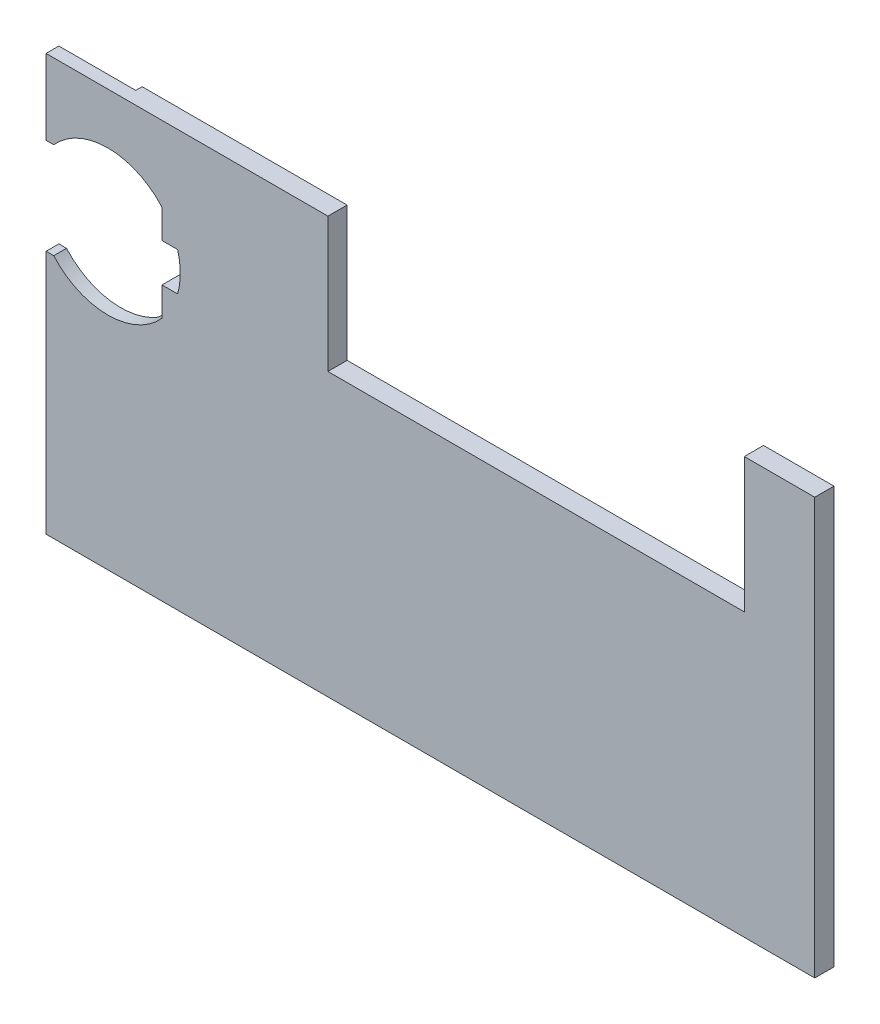
ISO-10303-21;
HEADER;
FILE_DESCRIPTION(('STEP AP214'),'2;1');
FILE_NAME('part.step','',(''),(''),'','','');
FILE_SCHEMA(('AUTOMOTIVE_DESIGN { 1 0 10303 214 1 1 1 1 }'));
ENDSEC;
DATA;
#1=APPLICATION_CONTEXT('core data for automotive mechanical design processes');
#2=APPLICATION_PROTOCOL_DEFINITION('international standard','automotive_design',2000,#1);
#3=PRODUCT_CONTEXT('',#1,'mechanical');
#4=PRODUCT('Part','Part','',(#3));
#5=PRODUCT_RELATED_PRODUCT_CATEGORY('part','',(#4));
#6=PRODUCT_DEFINITION_FORMATION('','',#4);
#7=PRODUCT_DEFINITION_CONTEXT('part definition',#1,'design');
#8=PRODUCT_DEFINITION('design','',#6,#7);
#9=PRODUCT_DEFINITION_SHAPE('','',#8);
#10=(LENGTH_UNIT() NAMED_UNIT(*) SI_UNIT(.MILLI.,.METRE.));
#11=(NAMED_UNIT(*) PLANE_ANGLE_UNIT() SI_UNIT($,.RADIAN.));
#12=(NAMED_UNIT(*) SI_UNIT($,.STERADIAN.) SOLID_ANGLE_UNIT());
#13=UNCERTAINTY_MEASURE_WITH_UNIT(LENGTH_MEASURE(1.E-05),#10,'distance_accuracy_value','');
#14=(GEOMETRIC_REPRESENTATION_CONTEXT(3) GLOBAL_UNCERTAINTY_ASSIGNED_CONTEXT((#13)) GLOBAL_UNIT_ASSIGNED_CONTEXT((#10,
#11,#12)) REPRESENTATION_CONTEXT('',''));
#15=CARTESIAN_POINT('',(0.,0.,0.));
#16=DIRECTION('',(0.,0.,1.));
#17=DIRECTION('',(1.,0.,0.));
#18=AXIS2_PLACEMENT_3D('',#15,#16,#17);
#19=CARTESIAN_POINT('',(-60.,32.5,3.));
#20=DIRECTION('',(0.,1.,0.));
#21=DIRECTION('',(0.,0.,1.));
#22=AXIS2_PLACEMENT_3D('',#19,#20,#21);
#23=PLANE('',#22);
#24=DIRECTION('',(0.,0.,-1.));
#25=VECTOR('',#24,1.);
#26=CARTESIAN_POINT('',(49.,32.5,3.));
#27=LINE('',#26,#25);
#28=CARTESIAN_POINT('',(49.,32.5,3.));
#29=VERTEX_POINT('',#28);
#30=CARTESIAN_POINT('',(49.,32.5,0.));
#31=VERTEX_POINT('',#30);
#32=EDGE_CURVE('E294',#29,#31,#27,.T.);
#33=ORIENTED_EDGE('',*,*,#32,.F.);
#34=DIRECTION('',(1.,0.,0.));
#35=VECTOR('',#34,1.);
#36=CARTESIAN_POINT('',(-60.,32.5,3.));
#37=LINE('',#36,#35);
#38=CARTESIAN_POINT('',(60.,32.5,3.));
#39=VERTEX_POINT('',#38);
#40=EDGE_CURVE('E285',#29,#39,#37,.T.);
#41=ORIENTED_EDGE('',*,*,#40,.T.);
#42=DIRECTION('',(0.,0.,-1.));
#43=VECTOR('',#42,1.);
#44=CARTESIAN_POINT('',(60.,32.5,3.));
#45=LINE('',#44,#43);
#46=CARTESIAN_POINT('',(60.,32.5,0.));
#47=VERTEX_POINT('',#46);
#48=EDGE_CURVE('E538',#39,#47,#45,.T.);
#49=ORIENTED_EDGE('',*,*,#48,.T.);
#50=DIRECTION('',(1.,0.,0.));
#51=VECTOR('',#50,1.);
#52=CARTESIAN_POINT('',(-60.,32.5,0.));
#53=LINE('',#52,#51);
#54=EDGE_CURVE('E438',#31,#47,#53,.T.);
#55=ORIENTED_EDGE('',*,*,#54,.F.);
#56=EDGE_LOOP('',(#33,#41,#49,#55));
#57=FACE_BOUND('',#56,.T.);
#58=ADVANCED_FACE('F33',(#57),#23,.T.);
#59=CARTESIAN_POINT('',(-60.,20.75,3.));
#60=DIRECTION('',(-1.,0.,0.));
#61=DIRECTION('',(0.,-1.,0.));
#62=AXIS2_PLACEMENT_3D('',#59,#60,#61);
#63=PLANE('',#62);
#64=DIRECTION('',(0.,1.,0.));
#65=VECTOR('',#64,1.);
#66=CARTESIAN_POINT('',(-60.,32.5,1.));
#67=LINE('',#66,#65);
#68=CARTESIAN_POINT('',(-60.,20.75,1.));
#69=VERTEX_POINT('',#68);
#70=CARTESIAN_POINT('',(-60.,32.5,1.));
#71=VERTEX_POINT('',#70);
#72=EDGE_CURVE('E304',#69,#71,#67,.T.);
#73=ORIENTED_EDGE('',*,*,#72,.F.);
#74=DIRECTION('',(0.,0.,-1.));
#75=VECTOR('',#74,1.);
#76=CARTESIAN_POINT('',(-60.,20.75,3.));
#77=LINE('',#76,#75);
#78=CARTESIAN_POINT('',(-60.,20.75,3.));
#79=VERTEX_POINT('',#78);
#80=EDGE_CURVE('E41',#79,#69,#77,.T.);
#81=ORIENTED_EDGE('',*,*,#80,.F.);
#82=DIRECTION('',(0.,1.,0.));
#83=VECTOR('',#82,1.);
#84=CARTESIAN_POINT('',(-60.,20.75,3.));
#85=LINE('',#84,#83);
#86=CARTESIAN_POINT('',(-60.,32.5,3.));
#87=VERTEX_POINT('',#86);
#88=EDGE_CURVE('E445',#79,#87,#85,.T.);
#89=ORIENTED_EDGE('',*,*,#88,.T.);
#90=DIRECTION('',(0.,0.,-1.));
#91=VECTOR('',#90,1.);
#92=CARTESIAN_POINT('',(-60.,32.5,3.));
#93=LINE('',#92,#91);
#94=EDGE_CURVE('E480',#87,#71,#93,.T.);
#95=ORIENTED_EDGE('',*,*,#94,.T.);
#96=EDGE_LOOP('',(#73,#81,#89,#95));
#97=FACE_BOUND('',#96,.T.);
#98=ADVANCED_FACE('F35',(#97),#63,.T.);
#99=CARTESIAN_POINT('',(-60.,20.75,3.));
#100=DIRECTION('',(0.,1.,0.));
#101=DIRECTION('',(0.,0.,1.));
#102=AXIS2_PLACEMENT_3D('',#99,#100,#101);
#103=PLANE('',#102);
#104=ORIENTED_EDGE('',*,*,#80,.T.);
#105=DIRECTION('',(1.,0.,0.));
#106=VECTOR('',#105,1.);
#107=CARTESIAN_POINT('',(-60.,20.75,1.));
#108=LINE('',#107,#106);
#109=CARTESIAN_POINT('',(-58.8,20.75,1.));
#110=VERTEX_POINT('',#109);
#111=EDGE_CURVE('E361',#69,#110,#108,.T.);
#112=ORIENTED_EDGE('',*,*,#111,.T.);
#113=DIRECTION('',(0.,0.,-1.));
#114=VECTOR('',#113,1.);
#115=CARTESIAN_POINT('',(-58.8,20.75,3.));
#116=LINE('',#115,#114);
#117=CARTESIAN_POINT('',(-58.8,20.75,3.));
#118=VERTEX_POINT('',#117);
#119=EDGE_CURVE('E508',#118,#110,#116,.T.);
#120=ORIENTED_EDGE('',*,*,#119,.F.);
#121=DIRECTION('',(1.,0.,0.));
#122=VECTOR('',#121,1.);
#123=CARTESIAN_POINT('',(-60.,20.75,3.));
#124=LINE('',#123,#122);
#125=EDGE_CURVE('E478',#79,#118,#124,.T.);
#126=ORIENTED_EDGE('',*,*,#125,.F.);
#127=EDGE_LOOP('',(#104,#112,#120,#126));
#128=FACE_BOUND('',#127,.T.);
#129=ADVANCED_FACE('F566',(#128),#103,.F.);
#130=CARTESIAN_POINT('',(-50.3477813563538,13.25,3.));
#131=DIRECTION('',(0.,0.,-1.));
#132=DIRECTION('',(-1.,0.,0.));
#133=AXIS2_PLACEMENT_3D('',#130,#131,#132);
#134=CYLINDRICAL_SURFACE('',#133,11.3);
#135=DIRECTION('',(0.,0.,-1.));
#136=VECTOR('',#135,1.);
#137=CARTESIAN_POINT('',(-44.45,22.8887849375658,3.));
#138=LINE('',#137,#136);
#139=CARTESIAN_POINT('',(-44.45,22.8887849375658,0.));
#140=VERTEX_POINT('',#139);
#141=CARTESIAN_POINT('',(-44.45,22.8887849375658,1.));
#142=VERTEX_POINT('',#141);
#143=EDGE_CURVE('E352',#140,#142,#138,.F.);
#144=ORIENTED_EDGE('',*,*,#143,.F.);
#145=CARTESIAN_POINT('',(-50.3477813563538,13.25,0.));
#146=DIRECTION('',(0.,0.,1.));
#147=DIRECTION('',(1.,0.,0.));
#148=AXIS2_PLACEMENT_3D('',#145,#146,#147);
#149=CIRCLE('',#148,11.3);
#150=CARTESIAN_POINT('',(-41.8955627127076,20.75,0.));
#151=VERTEX_POINT('',#150);
#152=EDGE_CURVE('E448',#151,#140,#149,.T.);
#153=ORIENTED_EDGE('',*,*,#152,.F.);
#154=DIRECTION('',(0.,0.,-1.));
#155=VECTOR('',#154,1.);
#156=CARTESIAN_POINT('',(-41.8955627127076,20.75,3.));
#157=LINE('',#156,#155);
#158=CARTESIAN_POINT('',(-41.8955627127076,20.75,3.));
#159=VERTEX_POINT('',#158);
#160=EDGE_CURVE('E511',#159,#151,#157,.T.);
#161=ORIENTED_EDGE('',*,*,#160,.F.);
#162=CARTESIAN_POINT('',(-50.3477813563538,13.25,3.));
#163=DIRECTION('',(0.,0.,1.));
#164=DIRECTION('',(1.,0.,0.));
#165=AXIS2_PLACEMENT_3D('',#162,#163,#164);
#166=CIRCLE('',#165,11.3);
#167=EDGE_CURVE('E475',#159,#118,#166,.T.);
#168=ORIENTED_EDGE('',*,*,#167,.T.);
#169=ORIENTED_EDGE('',*,*,#119,.T.);
#170=CARTESIAN_POINT('',(-50.3477813563538,13.25,1.));
#171=DIRECTION('',(0.,0.,1.));
#172=DIRECTION('',(1.,0.,0.));
#173=AXIS2_PLACEMENT_3D('',#170,#171,#172);
#174=CIRCLE('',#173,11.3);
#175=EDGE_CURVE('E359',#142,#110,#174,.T.);
#176=ORIENTED_EDGE('',*,*,#175,.F.);
#177=EDGE_LOOP('',(#144,#153,#161,#168,#169,#176));
#178=FACE_BOUND('',#177,.T.);
#179=ADVANCED_FACE('F570',(#178),#134,.F.);
#180=CARTESIAN_POINT('',(-41.8955627127076,20.75,3.));
#181=DIRECTION('',(1.,0.,0.));
#182=DIRECTION('',(0.,0.,-1.));
#183=AXIS2_PLACEMENT_3D('',#180,#181,#182);
#184=PLANE('',#183);
#185=DIRECTION('',(0.,-1.,0.));
#186=VECTOR('',#185,1.);
#187=CARTESIAN_POINT('',(-41.8955627127076,20.75,0.));
#188=LINE('',#187,#186);
#189=CARTESIAN_POINT('',(-41.8955627127076,16.25,0.));
#190=VERTEX_POINT('',#189);
#191=EDGE_CURVE('E502',#151,#190,#188,.T.);
#192=ORIENTED_EDGE('',*,*,#191,.T.);
#193=DIRECTION('',(0.,0.,-1.));
#194=VECTOR('',#193,1.);
#195=CARTESIAN_POINT('',(-41.8955627127076,16.25,3.));
#196=LINE('',#195,#194);
#197=CARTESIAN_POINT('',(-41.8955627127076,16.25,3.));
#198=VERTEX_POINT('',#197);
#199=EDGE_CURVE('E513',#198,#190,#196,.T.);
#200=ORIENTED_EDGE('',*,*,#199,.F.);
#201=DIRECTION('',(0.,-1.,0.));
#202=VECTOR('',#201,1.);
#203=CARTESIAN_POINT('',(-41.8955627127076,20.75,3.));
#204=LINE('',#203,#202);
#205=EDGE_CURVE('E473',#159,#198,#204,.T.);
#206=ORIENTED_EDGE('',*,*,#205,.F.);
#207=ORIENTED_EDGE('',*,*,#160,.T.);
#208=EDGE_LOOP('',(#192,#200,#206,#207));
#209=FACE_BOUND('',#208,.T.);
#210=ADVANCED_FACE('F578',(#209),#184,.F.);
#211=CARTESIAN_POINT('',(-41.8955627127076,16.25,3.));
#212=DIRECTION('',(0.,1.,0.));
#213=DIRECTION('',(0.,0.,1.));
#214=AXIS2_PLACEMENT_3D('',#211,#212,#213);
#215=PLANE('',#214);
#216=DIRECTION('',(1.,0.,0.));
#217=VECTOR('',#216,1.);
#218=CARTESIAN_POINT('',(-41.8955627127076,16.25,0.));
#219=LINE('',#218,#217);
#220=CARTESIAN_POINT('',(-39.4532873341424,16.25,0.));
#221=VERTEX_POINT('',#220);
#222=EDGE_CURVE('E500',#190,#221,#219,.T.);
#223=ORIENTED_EDGE('',*,*,#222,.T.);
#224=DIRECTION('',(0.,0.,-1.));
#225=VECTOR('',#224,1.);
#226=CARTESIAN_POINT('',(-39.4532873341424,16.25,3.));
#227=LINE('',#226,#225);
#228=CARTESIAN_POINT('',(-39.4532873341424,16.25,3.));
#229=VERTEX_POINT('',#228);
#230=EDGE_CURVE('E516',#229,#221,#227,.T.);
#231=ORIENTED_EDGE('',*,*,#230,.F.);
#232=DIRECTION('',(1.,0.,0.));
#233=VECTOR('',#232,1.);
#234=CARTESIAN_POINT('',(-41.8955627127076,16.25,3.));
#235=LINE('',#234,#233);
#236=EDGE_CURVE('E471',#198,#229,#235,.T.);
#237=ORIENTED_EDGE('',*,*,#236,.F.);
#238=ORIENTED_EDGE('',*,*,#199,.T.);
#239=EDGE_LOOP('',(#223,#231,#237,#238));
#240=FACE_BOUND('',#239,.T.);
#241=ADVANCED_FACE('F582',(#240),#215,.F.);
#242=CARTESIAN_POINT('',(-50.3477813563538,13.25,3.));
#243=DIRECTION('',(0.,0.,-1.));
#244=DIRECTION('',(-1.,0.,0.));
#245=AXIS2_PLACEMENT_3D('',#242,#243,#244);
#246=CYLINDRICAL_SURFACE('',#245,11.3);
#247=CARTESIAN_POINT('',(-50.3477813563538,13.25,0.));
#248=DIRECTION('',(0.,0.,-1.));
#249=DIRECTION('',(-1.,0.,0.));
#250=AXIS2_PLACEMENT_3D('',#247,#248,#249);
#251=CIRCLE('',#250,11.3);
#252=CARTESIAN_POINT('',(-39.4532873341424,10.25,0.));
#253=VERTEX_POINT('',#252);
#254=EDGE_CURVE('E497',#221,#253,#251,.T.);
#255=ORIENTED_EDGE('',*,*,#254,.T.);
#256=DIRECTION('',(0.,0.,-1.));
#257=VECTOR('',#256,1.);
#258=CARTESIAN_POINT('',(-39.4532873341424,10.25,3.));
#259=LINE('',#258,#257);
#260=CARTESIAN_POINT('',(-39.4532873341424,10.25,3.));
#261=VERTEX_POINT('',#260);
#262=EDGE_CURVE('E519',#261,#253,#259,.T.);
#263=ORIENTED_EDGE('',*,*,#262,.F.);
#264=CARTESIAN_POINT('',(-50.3477813563538,13.25,3.));
#265=DIRECTION('',(0.,0.,-1.));
#266=DIRECTION('',(-1.,0.,0.));
#267=AXIS2_PLACEMENT_3D('',#264,#265,#266);
#268=CIRCLE('',#267,11.3);
#269=EDGE_CURVE('E469',#229,#261,#268,.T.);
#270=ORIENTED_EDGE('',*,*,#269,.F.);
#271=ORIENTED_EDGE('',*,*,#230,.T.);
#272=EDGE_LOOP('',(#255,#263,#270,#271));
#273=FACE_BOUND('',#272,.T.);
#274=ADVANCED_FACE('F587',(#273),#246,.F.);
#275=CARTESIAN_POINT('',(-41.8955627127076,10.25,3.));
#276=DIRECTION('',(0.,1.,0.));
#277=DIRECTION('',(0.,0.,1.));
#278=AXIS2_PLACEMENT_3D('',#275,#276,#277);
#279=PLANE('',#278);
#280=DIRECTION('',(1.,0.,0.));
#281=VECTOR('',#280,1.);
#282=CARTESIAN_POINT('',(-41.8955627127076,10.25,0.));
#283=LINE('',#282,#281);
#284=CARTESIAN_POINT('',(-41.8955627127076,10.25,0.));
#285=VERTEX_POINT('',#284);
#286=EDGE_CURVE('E494',#285,#253,#283,.T.);
#287=ORIENTED_EDGE('',*,*,#286,.F.);
#288=DIRECTION('',(0.,0.,-1.));
#289=VECTOR('',#288,1.);
#290=CARTESIAN_POINT('',(-41.8955627127076,10.25,3.));
#291=LINE('',#290,#289);
#292=CARTESIAN_POINT('',(-41.8955627127076,10.25,3.));
#293=VERTEX_POINT('',#292);
#294=EDGE_CURVE('E521',#293,#285,#291,.T.);
#295=ORIENTED_EDGE('',*,*,#294,.F.);
#296=DIRECTION('',(1.,0.,0.));
#297=VECTOR('',#296,1.);
#298=CARTESIAN_POINT('',(-41.8955627127076,10.25,3.));
#299=LINE('',#298,#297);
#300=EDGE_CURVE('E466',#293,#261,#299,.T.);
#301=ORIENTED_EDGE('',*,*,#300,.T.);
#302=ORIENTED_EDGE('',*,*,#262,.T.);
#303=EDGE_LOOP('',(#287,#295,#301,#302));
#304=FACE_BOUND('',#303,.T.);
#305=ADVANCED_FACE('F594',(#304),#279,.T.);
#306=CARTESIAN_POINT('',(-41.8955627127076,10.25,3.));
#307=DIRECTION('',(1.,0.,0.));
#308=DIRECTION('',(0.,0.,-1.));
#309=AXIS2_PLACEMENT_3D('',#306,#307,#308);
#310=PLANE('',#309);
#311=DIRECTION('',(0.,-1.,0.));
#312=VECTOR('',#311,1.);
#313=CARTESIAN_POINT('',(-41.8955627127076,10.25,0.));
#314=LINE('',#313,#312);
#315=CARTESIAN_POINT('',(-41.8955627127076,5.75,0.));
#316=VERTEX_POINT('',#315);
#317=EDGE_CURVE('E491',#285,#316,#314,.T.);
#318=ORIENTED_EDGE('',*,*,#317,.T.);
#319=DIRECTION('',(0.,0.,-1.));
#320=VECTOR('',#319,1.);
#321=CARTESIAN_POINT('',(-41.8955627127076,5.75,3.));
#322=LINE('',#321,#320);
#323=CARTESIAN_POINT('',(-41.8955627127076,5.75,3.));
#324=VERTEX_POINT('',#323);
#325=EDGE_CURVE('E523',#324,#316,#322,.T.);
#326=ORIENTED_EDGE('',*,*,#325,.F.);
#327=DIRECTION('',(0.,-1.,0.));
#328=VECTOR('',#327,1.);
#329=CARTESIAN_POINT('',(-41.8955627127076,10.25,3.));
#330=LINE('',#329,#328);
#331=EDGE_CURVE('E464',#293,#324,#330,.T.);
#332=ORIENTED_EDGE('',*,*,#331,.F.);
#333=ORIENTED_EDGE('',*,*,#294,.T.);
#334=EDGE_LOOP('',(#318,#326,#332,#333));
#335=FACE_BOUND('',#334,.T.);
#336=ADVANCED_FACE('F597',(#335),#310,.F.);
#337=CARTESIAN_POINT('',(-50.3477813563538,13.25,3.));
#338=DIRECTION('',(0.,0.,-1.));
#339=DIRECTION('',(-1.,0.,0.));
#340=AXIS2_PLACEMENT_3D('',#337,#338,#339);
#341=CYLINDRICAL_SURFACE('',#340,11.3);
#342=DIRECTION('',(0.,0.,-1.));
#343=VECTOR('',#342,1.);
#344=CARTESIAN_POINT('',(-44.45,3.6112150624342,3.));
#345=LINE('',#344,#343);
#346=CARTESIAN_POINT('',(-44.45,3.6112150624342,1.));
#347=VERTEX_POINT('',#346);
#348=CARTESIAN_POINT('',(-44.45,3.6112150624342,0.));
#349=VERTEX_POINT('',#348);
#350=EDGE_CURVE('E56',#347,#349,#345,.T.);
#351=ORIENTED_EDGE('',*,*,#350,.F.);
#352=CARTESIAN_POINT('',(-50.3477813563538,13.25,1.));
#353=DIRECTION('',(0.,0.,1.));
#354=DIRECTION('',(1.,0.,0.));
#355=AXIS2_PLACEMENT_3D('',#352,#353,#354);
#356=CIRCLE('',#355,11.3);
#357=CARTESIAN_POINT('',(-58.8,5.75000000000001,1.));
#358=VERTEX_POINT('',#357);
#359=EDGE_CURVE('E357',#358,#347,#356,.T.);
#360=ORIENTED_EDGE('',*,*,#359,.F.);
#361=DIRECTION('',(0.,0.,-1.));
#362=VECTOR('',#361,1.);
#363=CARTESIAN_POINT('',(-58.8,5.75000000000001,3.));
#364=LINE('',#363,#362);
#365=CARTESIAN_POINT('',(-58.8,5.75000000000001,3.));
#366=VERTEX_POINT('',#365);
#367=EDGE_CURVE('E526',#366,#358,#364,.T.);
#368=ORIENTED_EDGE('',*,*,#367,.F.);
#369=CARTESIAN_POINT('',(-50.3477813563538,13.25,3.));
#370=DIRECTION('',(0.,0.,1.));
#371=DIRECTION('',(1.,0.,0.));
#372=AXIS2_PLACEMENT_3D('',#369,#370,#371);
#373=CIRCLE('',#372,11.3);
#374=EDGE_CURVE('E461',#366,#324,#373,.T.);
#375=ORIENTED_EDGE('',*,*,#374,.T.);
#376=ORIENTED_EDGE('',*,*,#325,.T.);
#377=CARTESIAN_POINT('',(-50.3477813563538,13.25,0.));
#378=DIRECTION('',(0.,0.,1.));
#379=DIRECTION('',(1.,0.,0.));
#380=AXIS2_PLACEMENT_3D('',#377,#378,#379);
#381=CIRCLE('',#380,11.3);
#382=EDGE_CURVE('E489',#349,#316,#381,.T.);
#383=ORIENTED_EDGE('',*,*,#382,.F.);
#384=EDGE_LOOP('',(#351,#360,#368,#375,#376,#383));
#385=FACE_BOUND('',#384,.T.);
#386=ADVANCED_FACE('F600',(#385),#341,.F.);
#387=CARTESIAN_POINT('',(-58.8,5.75000000000001,3.));
#388=DIRECTION('',(0.,-1.,0.));
#389=DIRECTION('',(0.,0.,-1.));
#390=AXIS2_PLACEMENT_3D('',#387,#388,#389);
#391=PLANE('',#390);
#392=ORIENTED_EDGE('',*,*,#367,.T.);
#393=DIRECTION('',(-1.,0.,0.));
#394=VECTOR('',#393,1.);
#395=CARTESIAN_POINT('',(-58.8,5.75000000000001,1.));
#396=LINE('',#395,#394);
#397=CARTESIAN_POINT('',(-60.,5.75000000000001,1.));
#398=VERTEX_POINT('',#397);
#399=EDGE_CURVE('E354',#358,#398,#396,.T.);
#400=ORIENTED_EDGE('',*,*,#399,.T.);
#401=DIRECTION('',(0.,0.,-1.));
#402=VECTOR('',#401,1.);
#403=CARTESIAN_POINT('',(-60.,5.75000000000001,3.));
#404=LINE('',#403,#402);
#405=CARTESIAN_POINT('',(-60.,5.75000000000001,3.));
#406=VERTEX_POINT('',#405);
#407=EDGE_CURVE('E529',#406,#398,#404,.T.);
#408=ORIENTED_EDGE('',*,*,#407,.F.);
#409=DIRECTION('',(-1.,0.,0.));
#410=VECTOR('',#409,1.);
#411=CARTESIAN_POINT('',(-58.8,5.75000000000001,3.));
#412=LINE('',#411,#410);
#413=EDGE_CURVE('E459',#366,#406,#412,.T.);
#414=ORIENTED_EDGE('',*,*,#413,.F.);
#415=EDGE_LOOP('',(#392,#400,#408,#414));
#416=FACE_BOUND('',#415,.T.);
#417=ADVANCED_FACE('F607',(#416),#391,.F.);
#418=CARTESIAN_POINT('',(-60.,5.75000000000001,3.));
#419=DIRECTION('',(1.,0.,0.));
#420=DIRECTION('',(0.,1.,0.));
#421=AXIS2_PLACEMENT_3D('',#418,#419,#420);
#422=PLANE('',#421);
#423=ORIENTED_EDGE('',*,*,#407,.T.);
#424=CARTESIAN_POINT('',(-60.,-32.5,1.));
#425=VERTEX_POINT('',#424);
#426=EDGE_CURVE('E301',#425,#398,#67,.T.);
#427=ORIENTED_EDGE('',*,*,#426,.F.);
#428=DIRECTION('',(0.,0.,-1.));
#429=VECTOR('',#428,1.);
#430=CARTESIAN_POINT('',(-60.,-32.5,3.));
#431=LINE('',#430,#429);
#432=CARTESIAN_POINT('',(-60.,-32.5,3.));
#433=VERTEX_POINT('',#432);
#434=EDGE_CURVE('E532',#433,#425,#431,.T.);
#435=ORIENTED_EDGE('',*,*,#434,.F.);
#436=DIRECTION('',(0.,-1.,0.));
#437=VECTOR('',#436,1.);
#438=CARTESIAN_POINT('',(-60.,5.75000000000001,3.));
#439=LINE('',#438,#437);
#440=EDGE_CURVE('E457',#406,#433,#439,.T.);
#441=ORIENTED_EDGE('',*,*,#440,.F.);
#442=EDGE_LOOP('',(#423,#427,#435,#441));
#443=FACE_BOUND('',#442,.T.);
#444=ADVANCED_FACE('F610',(#443),#422,.F.);
#445=CARTESIAN_POINT('',(-60.,-32.5,3.));
#446=DIRECTION('',(0.,1.,0.));
#447=DIRECTION('',(0.,0.,1.));
#448=AXIS2_PLACEMENT_3D('',#445,#446,#447);
#449=PLANE('',#448);
#450=DIRECTION('',(-1.,0.,0.));
#451=VECTOR('',#450,1.);
#452=CARTESIAN_POINT('',(-60.,-32.5,1.));
#453=LINE('',#452,#451);
#454=CARTESIAN_POINT('',(-48.,-32.5,1.));
#455=VERTEX_POINT('',#454);
#456=EDGE_CURVE('E323',#455,#425,#453,.T.);
#457=ORIENTED_EDGE('',*,*,#456,.F.);
#458=DIRECTION('',(0.,0.,-1.));
#459=VECTOR('',#458,1.);
#460=CARTESIAN_POINT('',(-48.,-32.5,1.));
#461=LINE('',#460,#459);
#462=CARTESIAN_POINT('',(-48.,-32.5,0.));
#463=VERTEX_POINT('',#462);
#464=EDGE_CURVE('E338',#455,#463,#461,.T.);
#465=ORIENTED_EDGE('',*,*,#464,.T.);
#466=DIRECTION('',(1.,0.,0.));
#467=VECTOR('',#466,1.);
#468=CARTESIAN_POINT('',(-60.,-32.5,0.));
#469=LINE('',#468,#467);
#470=CARTESIAN_POINT('',(60.,-32.5,0.));
#471=VERTEX_POINT('',#470);
#472=EDGE_CURVE('E487',#463,#471,#469,.T.);
#473=ORIENTED_EDGE('',*,*,#472,.T.);
#474=DIRECTION('',(0.,0.,-1.));
#475=VECTOR('',#474,1.);
#476=CARTESIAN_POINT('',(60.,-32.5,3.));
#477=LINE('',#476,#475);
#478=CARTESIAN_POINT('',(60.,-32.5,3.));
#479=VERTEX_POINT('',#478);
#480=EDGE_CURVE('E535',#479,#471,#477,.T.);
#481=ORIENTED_EDGE('',*,*,#480,.F.);
#482=DIRECTION('',(1.,0.,0.));
#483=VECTOR('',#482,1.);
#484=CARTESIAN_POINT('',(-60.,-32.5,3.));
#485=LINE('',#484,#483);
#486=EDGE_CURVE('E455',#433,#479,#485,.T.);
#487=ORIENTED_EDGE('',*,*,#486,.F.);
#488=ORIENTED_EDGE('',*,*,#434,.T.);
#489=EDGE_LOOP('',(#457,#465,#473,#481,#487,#488));
#490=FACE_BOUND('',#489,.T.);
#491=ADVANCED_FACE('F615',(#490),#449,.F.);
#492=CARTESIAN_POINT('',(60.,32.5,3.));
#493=DIRECTION('',(1.,0.,0.));
#494=DIRECTION('',(0.,1.,0.));
#495=AXIS2_PLACEMENT_3D('',#492,#493,#494);
#496=PLANE('',#495);
#497=DIRECTION('',(0.,-1.,0.));
#498=VECTOR('',#497,1.);
#499=CARTESIAN_POINT('',(60.,32.5,0.));
#500=LINE('',#499,#498);
#501=EDGE_CURVE('E484',#47,#471,#500,.T.);
#502=ORIENTED_EDGE('',*,*,#501,.F.);
#503=ORIENTED_EDGE('',*,*,#48,.F.);
#504=DIRECTION('',(0.,-1.,0.));
#505=VECTOR('',#504,1.);
#506=CARTESIAN_POINT('',(60.,32.5,3.));
#507=LINE('',#506,#505);
#508=EDGE_CURVE('E452',#39,#479,#507,.T.);
#509=ORIENTED_EDGE('',*,*,#508,.T.);
#510=ORIENTED_EDGE('',*,*,#480,.T.);
#511=EDGE_LOOP('',(#502,#503,#509,#510));
#512=FACE_BOUND('',#511,.T.);
#513=ADVANCED_FACE('F619',(#512),#496,.T.);
#514=DIRECTION('',(0.,0.,-1.));
#515=VECTOR('',#514,1.);
#516=CARTESIAN_POINT('',(-16.,32.5,3.));
#517=LINE('',#516,#515);
#518=CARTESIAN_POINT('',(-16.,32.5,3.));
#519=VERTEX_POINT('',#518);
#520=CARTESIAN_POINT('',(-16.,32.5,0.));
#521=VERTEX_POINT('',#520);
#522=EDGE_CURVE('E297',#519,#521,#517,.T.);
#523=ORIENTED_EDGE('',*,*,#522,.T.);
#524=CARTESIAN_POINT('',(-48.,32.5,0.));
#525=VERTEX_POINT('',#524);
#526=EDGE_CURVE('E481',#525,#521,#53,.T.);
#527=ORIENTED_EDGE('',*,*,#526,.F.);
#528=DIRECTION('',(0.,0.,-1.));
#529=VECTOR('',#528,1.);
#530=CARTESIAN_POINT('',(-48.,32.5,1.));
#531=LINE('',#530,#529);
#532=CARTESIAN_POINT('',(-48.,32.5,1.));
#533=VERTEX_POINT('',#532);
#534=EDGE_CURVE('E325',#533,#525,#531,.T.);
#535=ORIENTED_EDGE('',*,*,#534,.F.);
#536=DIRECTION('',(1.,0.,0.));
#537=VECTOR('',#536,1.);
#538=CARTESIAN_POINT('',(-60.,32.5,1.));
#539=LINE('',#538,#537);
#540=EDGE_CURVE('E303',#71,#533,#539,.T.);
#541=ORIENTED_EDGE('',*,*,#540,.F.);
#542=ORIENTED_EDGE('',*,*,#94,.F.);
#543=EDGE_CURVE('E449',#87,#519,#37,.T.);
#544=ORIENTED_EDGE('',*,*,#543,.T.);
#545=EDGE_LOOP('',(#523,#527,#535,#541,#542,#544));
#546=FACE_BOUND('',#545,.T.);
#547=ADVANCED_FACE('F547',(#546),#23,.T.);
#548=CARTESIAN_POINT('',(-50.3477813563538,13.25,3.));
#549=DIRECTION('',(0.,0.,1.));
#550=DIRECTION('',(1.,0.,0.));
#551=AXIS2_PLACEMENT_3D('',#548,#549,#550);
#552=PLANE('',#551);
#553=DIRECTION('',(0.,-1.,0.));
#554=VECTOR('',#553,1.);
#555=CARTESIAN_POINT('',(49.,32.5,3.));
#556=LINE('',#555,#554);
#557=CARTESIAN_POINT('',(49.,11.5,3.));
#558=VERTEX_POINT('',#557);
#559=EDGE_CURVE('E267',#29,#558,#556,.T.);
#560=ORIENTED_EDGE('',*,*,#559,.T.);
#561=DIRECTION('',(-1.,0.,0.));
#562=VECTOR('',#561,1.);
#563=CARTESIAN_POINT('',(49.,11.5,3.));
#564=LINE('',#563,#562);
#565=CARTESIAN_POINT('',(-16.,11.5,3.));
#566=VERTEX_POINT('',#565);
#567=EDGE_CURVE('E276',#558,#566,#564,.T.);
#568=ORIENTED_EDGE('',*,*,#567,.T.);
#569=DIRECTION('',(0.,1.,0.));
#570=VECTOR('',#569,1.);
#571=CARTESIAN_POINT('',(-16.,32.5,3.));
#572=LINE('',#571,#570);
#573=EDGE_CURVE('E273',#566,#519,#572,.T.);
#574=ORIENTED_EDGE('',*,*,#573,.T.);
#575=ORIENTED_EDGE('',*,*,#543,.F.);
#576=ORIENTED_EDGE('',*,*,#88,.F.);
#577=ORIENTED_EDGE('',*,*,#125,.T.);
#578=ORIENTED_EDGE('',*,*,#167,.F.);
#579=ORIENTED_EDGE('',*,*,#205,.T.);
#580=ORIENTED_EDGE('',*,*,#236,.T.);
#581=ORIENTED_EDGE('',*,*,#269,.T.);
#582=ORIENTED_EDGE('',*,*,#300,.F.);
#583=ORIENTED_EDGE('',*,*,#331,.T.);
#584=ORIENTED_EDGE('',*,*,#374,.F.);
#585=ORIENTED_EDGE('',*,*,#413,.T.);
#586=ORIENTED_EDGE('',*,*,#440,.T.);
#587=ORIENTED_EDGE('',*,*,#486,.T.);
#588=ORIENTED_EDGE('',*,*,#508,.F.);
#589=ORIENTED_EDGE('',*,*,#40,.F.);
#590=EDGE_LOOP('',(#560,#568,#574,#575,#576,#577,#578,#579,#580,#581,#582,#583,#584,#585,#586,
#587,#588,#589));
#591=FACE_BOUND('',#590,.T.);
#592=ADVANCED_FACE('F283',(#591),#552,.T.);
#593=CARTESIAN_POINT('',(-50.3477813563538,13.25,0.));
#594=DIRECTION('',(0.,0.,1.));
#595=DIRECTION('',(1.,0.,0.));
#596=AXIS2_PLACEMENT_3D('',#593,#594,#595);
#597=PLANE('',#596);
#598=DIRECTION('',(-1.,0.,0.));
#599=VECTOR('',#598,1.);
#600=CARTESIAN_POINT('',(59.,-31.5,0.));
#601=LINE('',#600,#599);
#602=CARTESIAN_POINT('',(59.,-31.5,0.));
#603=VERTEX_POINT('',#602);
#604=CARTESIAN_POINT('',(-43.45,-31.5,0.));
#605=VERTEX_POINT('',#604);
#606=EDGE_CURVE('E386',#603,#605,#601,.T.);
#607=ORIENTED_EDGE('',*,*,#606,.F.);
#608=DIRECTION('',(0.,-1.,0.));
#609=VECTOR('',#608,1.);
#610=CARTESIAN_POINT('',(59.,31.5,0.));
#611=LINE('',#610,#609);
#612=CARTESIAN_POINT('',(59.,31.5,0.));
#613=VERTEX_POINT('',#612);
#614=EDGE_CURVE('E364',#613,#603,#611,.T.);
#615=ORIENTED_EDGE('',*,*,#614,.F.);
#616=DIRECTION('',(1.,0.,0.));
#617=VECTOR('',#616,1.);
#618=CARTESIAN_POINT('',(59.,31.5,0.));
#619=LINE('',#618,#617);
#620=CARTESIAN_POINT('',(56.,31.5,0.));
#621=VERTEX_POINT('',#620);
#622=EDGE_CURVE('E369',#621,#613,#619,.T.);
#623=ORIENTED_EDGE('',*,*,#622,.F.);
#624=DIRECTION('',(0.,1.,0.));
#625=VECTOR('',#624,1.);
#626=CARTESIAN_POINT('',(56.,31.5,0.));
#627=LINE('',#626,#625);
#628=CARTESIAN_POINT('',(56.,-28.5,0.));
#629=VERTEX_POINT('',#628);
#630=EDGE_CURVE('E395',#629,#621,#627,.T.);
#631=ORIENTED_EDGE('',*,*,#630,.F.);
#632=DIRECTION('',(1.,0.,0.));
#633=VECTOR('',#632,1.);
#634=CARTESIAN_POINT('',(56.,-28.5,0.));
#635=LINE('',#634,#633);
#636=CARTESIAN_POINT('',(-43.45,-28.5,0.));
#637=VERTEX_POINT('',#636);
#638=EDGE_CURVE('E392',#637,#629,#635,.T.);
#639=ORIENTED_EDGE('',*,*,#638,.F.);
#640=DIRECTION('',(0.,1.,0.));
#641=VECTOR('',#640,1.);
#642=CARTESIAN_POINT('',(-43.45,-28.5,0.));
#643=LINE('',#642,#641);
#644=EDGE_CURVE('E389',#605,#637,#643,.T.);
#645=ORIENTED_EDGE('',*,*,#644,.F.);
#646=EDGE_LOOP('',(#607,#615,#623,#631,#639,#645));
#647=FACE_BOUND('',#646,.T.);
#648=DIRECTION('',(1.,0.,0.));
#649=VECTOR('',#648,1.);
#650=CARTESIAN_POINT('',(-23.,31.5,0.));
#651=LINE('',#650,#649);
#652=CARTESIAN_POINT('',(-43.45,31.5,0.));
#653=VERTEX_POINT('',#652);
#654=CARTESIAN_POINT('',(-23.,31.5,0.));
#655=VERTEX_POINT('',#654);
#656=EDGE_CURVE('E428',#653,#655,#651,.T.);
#657=ORIENTED_EDGE('',*,*,#656,.F.);
#658=DIRECTION('',(0.,1.,0.));
#659=VECTOR('',#658,1.);
#660=CARTESIAN_POINT('',(-43.45,31.5,0.));
#661=LINE('',#660,#659);
#662=CARTESIAN_POINT('',(-43.45,28.5,0.));
#663=VERTEX_POINT('',#662);
#664=EDGE_CURVE('E402',#663,#653,#661,.T.);
#665=ORIENTED_EDGE('',*,*,#664,.F.);
#666=DIRECTION('',(-1.,0.,0.));
#667=VECTOR('',#666,1.);
#668=CARTESIAN_POINT('',(-23.,28.5,0.));
#669=LINE('',#668,#667);
#670=CARTESIAN_POINT('',(-23.,28.5,0.));
#671=VERTEX_POINT('',#670);
#672=EDGE_CURVE('E417',#671,#663,#669,.T.);
#673=ORIENTED_EDGE('',*,*,#672,.F.);
#674=DIRECTION('',(0.,-1.,0.));
#675=VECTOR('',#674,1.);
#676=CARTESIAN_POINT('',(-23.,31.5,0.));
#677=LINE('',#676,#675);
#678=EDGE_CURVE('E431',#655,#671,#677,.T.);
#679=ORIENTED_EDGE('',*,*,#678,.F.);
#680=EDGE_LOOP('',(#657,#665,#673,#679));
#681=FACE_BOUND('',#680,.T.);
#682=DIRECTION('',(-1.,0.,0.));
#683=VECTOR('',#682,1.);
#684=CARTESIAN_POINT('',(49.,11.5,0.));
#685=LINE('',#684,#683);
#686=CARTESIAN_POINT('',(49.,11.5,0.));
#687=VERTEX_POINT('',#686);
#688=CARTESIAN_POINT('',(-16.,11.5,0.));
#689=VERTEX_POINT('',#688);
#690=EDGE_CURVE('E288',#687,#689,#685,.T.);
#691=ORIENTED_EDGE('',*,*,#690,.F.);
#692=DIRECTION('',(0.,-1.,0.));
#693=VECTOR('',#692,1.);
#694=CARTESIAN_POINT('',(49.,32.5,0.));
#695=LINE('',#694,#693);
#696=EDGE_CURVE('E48',#31,#687,#695,.T.);
#697=ORIENTED_EDGE('',*,*,#696,.F.);
#698=ORIENTED_EDGE('',*,*,#54,.T.);
#699=ORIENTED_EDGE('',*,*,#501,.T.);
#700=ORIENTED_EDGE('',*,*,#472,.F.);
#701=DIRECTION('',(0.,-1.,0.));
#702=VECTOR('',#701,1.);
#703=CARTESIAN_POINT('',(-48.,-27.5,0.));
#704=LINE('',#703,#702);
#705=CARTESIAN_POINT('',(-48.,-27.5,0.));
#706=VERTEX_POINT('',#705);
#707=EDGE_CURVE('E336',#706,#463,#704,.T.);
#708=ORIENTED_EDGE('',*,*,#707,.F.);
#709=DIRECTION('',(-1.,0.,0.));
#710=VECTOR('',#709,1.);
#711=CARTESIAN_POINT('',(-44.45,-27.5,0.));
#712=LINE('',#711,#710);
#713=CARTESIAN_POINT('',(-44.45,-27.5,0.));
#714=VERTEX_POINT('',#713);
#715=EDGE_CURVE('E333',#714,#706,#712,.T.);
#716=ORIENTED_EDGE('',*,*,#715,.F.);
#717=DIRECTION('',(0.,1.,0.));
#718=VECTOR('',#717,1.);
#719=CARTESIAN_POINT('',(-44.45,13.25,0.));
#720=LINE('',#719,#718);
#721=EDGE_CURVE('E11',#714,#349,#720,.T.);
#722=ORIENTED_EDGE('',*,*,#721,.T.);
#723=ORIENTED_EDGE('',*,*,#382,.T.);
#724=ORIENTED_EDGE('',*,*,#317,.F.);
#725=ORIENTED_EDGE('',*,*,#286,.T.);
#726=ORIENTED_EDGE('',*,*,#254,.F.);
#727=ORIENTED_EDGE('',*,*,#222,.F.);
#728=ORIENTED_EDGE('',*,*,#191,.F.);
#729=ORIENTED_EDGE('',*,*,#152,.T.);
#730=DIRECTION('',(0.,-1.,0.));
#731=VECTOR('',#730,1.);
#732=CARTESIAN_POINT('',(-44.45,27.5,0.));
#733=LINE('',#732,#731);
#734=CARTESIAN_POINT('',(-44.45,27.5,0.));
#735=VERTEX_POINT('',#734);
#736=EDGE_CURVE('E331',#735,#140,#733,.T.);
#737=ORIENTED_EDGE('',*,*,#736,.F.);
#738=DIRECTION('',(1.,0.,0.));
#739=VECTOR('',#738,1.);
#740=CARTESIAN_POINT('',(-48.,27.5,0.));
#741=LINE('',#740,#739);
#742=CARTESIAN_POINT('',(-48.,27.5,0.));
#743=VERTEX_POINT('',#742);
#744=EDGE_CURVE('E328',#743,#735,#741,.T.);
#745=ORIENTED_EDGE('',*,*,#744,.F.);
#746=DIRECTION('',(0.,-1.,0.));
#747=VECTOR('',#746,1.);
#748=CARTESIAN_POINT('',(-48.,32.5,0.));
#749=LINE('',#748,#747);
#750=EDGE_CURVE('E296',#525,#743,#749,.T.);
#751=ORIENTED_EDGE('',*,*,#750,.F.);
#752=ORIENTED_EDGE('',*,*,#526,.T.);
#753=DIRECTION('',(0.,1.,0.));
#754=VECTOR('',#753,1.);
#755=CARTESIAN_POINT('',(-16.,32.5,0.));
#756=LINE('',#755,#754);
#757=EDGE_CURVE('E286',#689,#521,#756,.T.);
#758=ORIENTED_EDGE('',*,*,#757,.F.);
#759=EDGE_LOOP('',(#691,#697,#698,#699,#700,#708,#716,#722,#723,#724,#725,#726,#727,#728,#729,
#737,#745,#751,#752,#758));
#760=FACE_BOUND('',#759,.T.);
#761=ADVANCED_FACE('F555',(#647,#681,#760),#597,.F.);
#762=CARTESIAN_POINT('',(-43.45,31.5,1.));
#763=DIRECTION('',(-1.,0.,0.));
#764=DIRECTION('',(0.,0.,1.));
#765=AXIS2_PLACEMENT_3D('',#762,#763,#764);
#766=PLANE('',#765);
#767=ORIENTED_EDGE('',*,*,#664,.T.);
#768=DIRECTION('',(0.,0.,-1.));
#769=VECTOR('',#768,1.);
#770=CARTESIAN_POINT('',(-43.45,31.5,1.));
#771=LINE('',#770,#769);
#772=CARTESIAN_POINT('',(-43.45,31.5,1.));
#773=VERTEX_POINT('',#772);
#774=EDGE_CURVE('E426',#773,#653,#771,.T.);
#775=ORIENTED_EDGE('',*,*,#774,.F.);
#776=DIRECTION('',(0.,1.,0.));
#777=VECTOR('',#776,1.);
#778=CARTESIAN_POINT('',(-43.45,31.5,1.));
#779=LINE('',#778,#777);
#780=CARTESIAN_POINT('',(-43.45,28.5,1.));
#781=VERTEX_POINT('',#780);
#782=EDGE_CURVE('E413',#781,#773,#779,.T.);
#783=ORIENTED_EDGE('',*,*,#782,.F.);
#784=DIRECTION('',(0.,0.,-1.));
#785=VECTOR('',#784,1.);
#786=CARTESIAN_POINT('',(-43.45,28.5,1.));
#787=LINE('',#786,#785);
#788=EDGE_CURVE('E436',#781,#663,#787,.T.);
#789=ORIENTED_EDGE('',*,*,#788,.T.);
#790=EDGE_LOOP('',(#767,#775,#783,#789));
#791=FACE_BOUND('',#790,.T.);
#792=ADVANCED_FACE('F685',(#791),#766,.F.);
#793=CARTESIAN_POINT('',(-23.,28.5,1.));
#794=DIRECTION('',(0.,-1.,0.));
#795=DIRECTION('',(0.,0.,-1.));
#796=AXIS2_PLACEMENT_3D('',#793,#794,#795);
#797=PLANE('',#796);
#798=ORIENTED_EDGE('',*,*,#672,.T.);
#799=ORIENTED_EDGE('',*,*,#788,.F.);
#800=DIRECTION('',(-1.,0.,0.));
#801=VECTOR('',#800,1.);
#802=CARTESIAN_POINT('',(-23.,28.5,1.));
#803=LINE('',#802,#801);
#804=CARTESIAN_POINT('',(-23.,28.5,1.));
#805=VERTEX_POINT('',#804);
#806=EDGE_CURVE('E423',#805,#781,#803,.T.);
#807=ORIENTED_EDGE('',*,*,#806,.F.);
#808=DIRECTION('',(0.,0.,-1.));
#809=VECTOR('',#808,1.);
#810=CARTESIAN_POINT('',(-23.,28.5,1.));
#811=LINE('',#810,#809);
#812=EDGE_CURVE('E439',#805,#671,#811,.T.);
#813=ORIENTED_EDGE('',*,*,#812,.T.);
#814=EDGE_LOOP('',(#798,#799,#807,#813));
#815=FACE_BOUND('',#814,.T.);
#816=ADVANCED_FACE('F690',(#815),#797,.F.);
#817=CARTESIAN_POINT('',(-23.,31.5,1.));
#818=DIRECTION('',(1.,0.,0.));
#819=DIRECTION('',(0.,0.,-1.));
#820=AXIS2_PLACEMENT_3D('',#817,#818,#819);
#821=PLANE('',#820);
#822=ORIENTED_EDGE('',*,*,#678,.T.);
#823=ORIENTED_EDGE('',*,*,#812,.F.);
#824=DIRECTION('',(0.,-1.,0.));
#825=VECTOR('',#824,1.);
#826=CARTESIAN_POINT('',(-23.,31.5,1.));
#827=LINE('',#826,#825);
#828=CARTESIAN_POINT('',(-23.,31.5,1.));
#829=VERTEX_POINT('',#828);
#830=EDGE_CURVE('E420',#829,#805,#827,.T.);
#831=ORIENTED_EDGE('',*,*,#830,.F.);
#832=DIRECTION('',(0.,0.,-1.));
#833=VECTOR('',#832,1.);
#834=CARTESIAN_POINT('',(-23.,31.5,1.));
#835=LINE('',#834,#833);
#836=EDGE_CURVE('E441',#829,#655,#835,.T.);
#837=ORIENTED_EDGE('',*,*,#836,.T.);
#838=EDGE_LOOP('',(#822,#823,#831,#837));
#839=FACE_BOUND('',#838,.T.);
#840=ADVANCED_FACE('F696',(#839),#821,.F.);
#841=CARTESIAN_POINT('',(-23.,31.5,1.));
#842=DIRECTION('',(0.,1.,0.));
#843=DIRECTION('',(0.,0.,1.));
#844=AXIS2_PLACEMENT_3D('',#841,#842,#843);
#845=PLANE('',#844);
#846=ORIENTED_EDGE('',*,*,#656,.T.);
#847=ORIENTED_EDGE('',*,*,#836,.F.);
#848=DIRECTION('',(1.,0.,0.));
#849=VECTOR('',#848,1.);
#850=CARTESIAN_POINT('',(-23.,31.5,1.));
#851=LINE('',#850,#849);
#852=EDGE_CURVE('E416',#773,#829,#851,.T.);
#853=ORIENTED_EDGE('',*,*,#852,.F.);
#854=ORIENTED_EDGE('',*,*,#774,.T.);
#855=EDGE_LOOP('',(#846,#847,#853,#854));
#856=FACE_BOUND('',#855,.T.);
#857=ADVANCED_FACE('F692',(#856),#845,.F.);
#858=CARTESIAN_POINT('',(0.,0.,1.));
#859=DIRECTION('',(0.,0.,-1.));
#860=DIRECTION('',(-1.,0.,0.));
#861=AXIS2_PLACEMENT_3D('',#858,#859,#860);
#862=PLANE('',#861);
#863=ORIENTED_EDGE('',*,*,#782,.T.);
#864=ORIENTED_EDGE('',*,*,#852,.T.);
#865=ORIENTED_EDGE('',*,*,#830,.T.);
#866=ORIENTED_EDGE('',*,*,#806,.T.);
#867=EDGE_LOOP('',(#863,#864,#865,#866));
#868=FACE_BOUND('',#867,.T.);
#869=ADVANCED_FACE('F695',(#868),#862,.T.);
#870=CARTESIAN_POINT('',(59.,31.5,1.));
#871=DIRECTION('',(1.,0.,0.));
#872=DIRECTION('',(0.,0.,-1.));
#873=AXIS2_PLACEMENT_3D('',#870,#871,#872);
#874=PLANE('',#873);
#875=ORIENTED_EDGE('',*,*,#614,.T.);
#876=DIRECTION('',(0.,0.,-1.));
#877=VECTOR('',#876,1.);
#878=CARTESIAN_POINT('',(59.,-31.5,1.));
#879=LINE('',#878,#877);
#880=CARTESIAN_POINT('',(59.,-31.5,1.));
#881=VERTEX_POINT('',#880);
#882=EDGE_CURVE('E384',#881,#603,#879,.T.);
#883=ORIENTED_EDGE('',*,*,#882,.F.);
#884=DIRECTION('',(0.,-1.,0.));
#885=VECTOR('',#884,1.);
#886=CARTESIAN_POINT('',(59.,31.5,1.));
#887=LINE('',#886,#885);
#888=CARTESIAN_POINT('',(59.,31.5,1.));
#889=VERTEX_POINT('',#888);
#890=EDGE_CURVE('E365',#889,#881,#887,.T.);
#891=ORIENTED_EDGE('',*,*,#890,.F.);
#892=DIRECTION('',(0.,0.,-1.));
#893=VECTOR('',#892,1.);
#894=CARTESIAN_POINT('',(59.,31.5,1.));
#895=LINE('',#894,#893);
#896=EDGE_CURVE('E400',#889,#613,#895,.T.);
#897=ORIENTED_EDGE('',*,*,#896,.T.);
#898=EDGE_LOOP('',(#875,#883,#891,#897));
#899=FACE_BOUND('',#898,.T.);
#900=ADVANCED_FACE('F706',(#899),#874,.F.);
#901=CARTESIAN_POINT('',(59.,31.5,1.));
#902=DIRECTION('',(0.,1.,0.));
#903=DIRECTION('',(0.,0.,1.));
#904=AXIS2_PLACEMENT_3D('',#901,#902,#903);
#905=PLANE('',#904);
#906=ORIENTED_EDGE('',*,*,#622,.T.);
#907=ORIENTED_EDGE('',*,*,#896,.F.);
#908=DIRECTION('',(1.,0.,0.));
#909=VECTOR('',#908,1.);
#910=CARTESIAN_POINT('',(59.,31.5,1.));
#911=LINE('',#910,#909);
#912=CARTESIAN_POINT('',(56.,31.5,1.));
#913=VERTEX_POINT('',#912);
#914=EDGE_CURVE('E381',#913,#889,#911,.T.);
#915=ORIENTED_EDGE('',*,*,#914,.F.);
#916=DIRECTION('',(0.,0.,-1.));
#917=VECTOR('',#916,1.);
#918=CARTESIAN_POINT('',(56.,31.5,1.));
#919=LINE('',#918,#917);
#920=EDGE_CURVE('E403',#913,#621,#919,.T.);
#921=ORIENTED_EDGE('',*,*,#920,.T.);
#922=EDGE_LOOP('',(#906,#907,#915,#921));
#923=FACE_BOUND('',#922,.T.);
#924=ADVANCED_FACE('F710',(#923),#905,.F.);
#925=CARTESIAN_POINT('',(56.,31.5,1.));
#926=DIRECTION('',(-1.,0.,0.));
#927=DIRECTION('',(0.,-1.,0.));
#928=AXIS2_PLACEMENT_3D('',#925,#926,#927);
#929=PLANE('',#928);
#930=ORIENTED_EDGE('',*,*,#630,.T.);
#931=ORIENTED_EDGE('',*,*,#920,.F.);
#932=DIRECTION('',(0.,1.,0.));
#933=VECTOR('',#932,1.);
#934=CARTESIAN_POINT('',(56.,31.5,1.));
#935=LINE('',#934,#933);
#936=CARTESIAN_POINT('',(56.,-28.5,1.));
#937=VERTEX_POINT('',#936);
#938=EDGE_CURVE('E378',#937,#913,#935,.T.);
#939=ORIENTED_EDGE('',*,*,#938,.F.);
#940=DIRECTION('',(0.,0.,-1.));
#941=VECTOR('',#940,1.);
#942=CARTESIAN_POINT('',(56.,-28.5,1.));
#943=LINE('',#942,#941);
#944=EDGE_CURVE('E405',#937,#629,#943,.T.);
#945=ORIENTED_EDGE('',*,*,#944,.T.);
#946=EDGE_LOOP('',(#930,#931,#939,#945));
#947=FACE_BOUND('',#946,.T.);
#948=ADVANCED_FACE('F724',(#947),#929,.F.);
#949=CARTESIAN_POINT('',(56.,-28.5,1.));
#950=DIRECTION('',(0.,1.,0.));
#951=DIRECTION('',(0.,0.,1.));
#952=AXIS2_PLACEMENT_3D('',#949,#950,#951);
#953=PLANE('',#952);
#954=ORIENTED_EDGE('',*,*,#638,.T.);
#955=ORIENTED_EDGE('',*,*,#944,.F.);
#956=DIRECTION('',(1.,0.,0.));
#957=VECTOR('',#956,1.);
#958=CARTESIAN_POINT('',(56.,-28.5,1.));
#959=LINE('',#958,#957);
#960=CARTESIAN_POINT('',(-43.45,-28.5,1.));
#961=VERTEX_POINT('',#960);
#962=EDGE_CURVE('E375',#961,#937,#959,.T.);
#963=ORIENTED_EDGE('',*,*,#962,.F.);
#964=DIRECTION('',(0.,0.,-1.));
#965=VECTOR('',#964,1.);
#966=CARTESIAN_POINT('',(-43.45,-28.5,1.));
#967=LINE('',#966,#965);
#968=EDGE_CURVE('E407',#961,#637,#967,.T.);
#969=ORIENTED_EDGE('',*,*,#968,.T.);
#970=EDGE_LOOP('',(#954,#955,#963,#969));
#971=FACE_BOUND('',#970,.T.);
#972=ADVANCED_FACE('F720',(#971),#953,.F.);
#973=CARTESIAN_POINT('',(-43.45,-28.5,1.));
#974=DIRECTION('',(-1.,0.,0.));
#975=DIRECTION('',(0.,-1.,0.));
#976=AXIS2_PLACEMENT_3D('',#973,#974,#975);
#977=PLANE('',#976);
#978=ORIENTED_EDGE('',*,*,#644,.T.);
#979=ORIENTED_EDGE('',*,*,#968,.F.);
#980=DIRECTION('',(0.,1.,0.));
#981=VECTOR('',#980,1.);
#982=CARTESIAN_POINT('',(-43.45,-28.5,1.));
#983=LINE('',#982,#981);
#984=CARTESIAN_POINT('',(-43.45,-31.5,1.));
#985=VERTEX_POINT('',#984);
#986=EDGE_CURVE('E372',#985,#961,#983,.T.);
#987=ORIENTED_EDGE('',*,*,#986,.F.);
#988=DIRECTION('',(0.,0.,-1.));
#989=VECTOR('',#988,1.);
#990=CARTESIAN_POINT('',(-43.45,-31.5,1.));
#991=LINE('',#990,#989);
#992=EDGE_CURVE('E409',#985,#605,#991,.T.);
#993=ORIENTED_EDGE('',*,*,#992,.T.);
#994=EDGE_LOOP('',(#978,#979,#987,#993));
#995=FACE_BOUND('',#994,.T.);
#996=ADVANCED_FACE('F716',(#995),#977,.F.);
#997=CARTESIAN_POINT('',(59.,-31.5,1.));
#998=DIRECTION('',(0.,-1.,0.));
#999=DIRECTION('',(0.,0.,-1.));
#1000=AXIS2_PLACEMENT_3D('',#997,#998,#999);
#1001=PLANE('',#1000);
#1002=ORIENTED_EDGE('',*,*,#606,.T.);
#1003=ORIENTED_EDGE('',*,*,#992,.F.);
#1004=DIRECTION('',(-1.,0.,0.));
#1005=VECTOR('',#1004,1.);
#1006=CARTESIAN_POINT('',(59.,-31.5,1.));
#1007=LINE('',#1006,#1005);
#1008=EDGE_CURVE('E368',#881,#985,#1007,.T.);
#1009=ORIENTED_EDGE('',*,*,#1008,.F.);
#1010=ORIENTED_EDGE('',*,*,#882,.T.);
#1011=EDGE_LOOP('',(#1002,#1003,#1009,#1010));
#1012=FACE_BOUND('',#1011,.T.);
#1013=ADVANCED_FACE('F712',(#1012),#1001,.F.);
#1014=CARTESIAN_POINT('',(0.,0.,1.));
#1015=DIRECTION('',(0.,0.,-1.));
#1016=DIRECTION('',(-1.,0.,0.));
#1017=AXIS2_PLACEMENT_3D('',#1014,#1015,#1016);
#1018=PLANE('',#1017);
#1019=ORIENTED_EDGE('',*,*,#890,.T.);
#1020=ORIENTED_EDGE('',*,*,#1008,.T.);
#1021=ORIENTED_EDGE('',*,*,#986,.T.);
#1022=ORIENTED_EDGE('',*,*,#962,.T.);
#1023=ORIENTED_EDGE('',*,*,#938,.T.);
#1024=ORIENTED_EDGE('',*,*,#914,.T.);
#1025=EDGE_LOOP('',(#1019,#1020,#1021,#1022,#1023,#1024));
#1026=FACE_BOUND('',#1025,.T.);
#1027=ADVANCED_FACE('F715',(#1026),#1018,.T.);
#1028=CARTESIAN_POINT('',(-48.,32.5,1.));
#1029=DIRECTION('',(1.,0.,0.));
#1030=DIRECTION('',(0.,0.,-1.));
#1031=AXIS2_PLACEMENT_3D('',#1028,#1029,#1030);
#1032=PLANE('',#1031);
#1033=ORIENTED_EDGE('',*,*,#750,.T.);
#1034=DIRECTION('',(0.,0.,-1.));
#1035=VECTOR('',#1034,1.);
#1036=CARTESIAN_POINT('',(-48.,27.5,1.));
#1037=LINE('',#1036,#1035);
#1038=CARTESIAN_POINT('',(-48.,27.5,1.));
#1039=VERTEX_POINT('',#1038);
#1040=EDGE_CURVE('E348',#1039,#743,#1037,.T.);
#1041=ORIENTED_EDGE('',*,*,#1040,.F.);
#1042=DIRECTION('',(0.,-1.,0.));
#1043=VECTOR('',#1042,1.);
#1044=CARTESIAN_POINT('',(-48.,32.5,1.));
#1045=LINE('',#1044,#1043);
#1046=EDGE_CURVE('E307',#533,#1039,#1045,.T.);
#1047=ORIENTED_EDGE('',*,*,#1046,.F.);
#1048=ORIENTED_EDGE('',*,*,#534,.T.);
#1049=EDGE_LOOP('',(#1033,#1041,#1047,#1048));
#1050=FACE_BOUND('',#1049,.T.);
#1051=ADVANCED_FACE('F559',(#1050),#1032,.F.);
#1052=CARTESIAN_POINT('',(-48.,27.5,1.));
#1053=DIRECTION('',(0.,1.,0.));
#1054=DIRECTION('',(0.,0.,1.));
#1055=AXIS2_PLACEMENT_3D('',#1052,#1053,#1054);
#1056=PLANE('',#1055);
#1057=ORIENTED_EDGE('',*,*,#744,.T.);
#1058=DIRECTION('',(0.,0.,-1.));
#1059=VECTOR('',#1058,1.);
#1060=CARTESIAN_POINT('',(-44.45,27.5,1.));
#1061=LINE('',#1060,#1059);
#1062=CARTESIAN_POINT('',(-44.45,27.5,1.));
#1063=VERTEX_POINT('',#1062);
#1064=EDGE_CURVE('E346',#1063,#735,#1061,.T.);
#1065=ORIENTED_EDGE('',*,*,#1064,.F.);
#1066=DIRECTION('',(1.,0.,0.));
#1067=VECTOR('',#1066,1.);
#1068=CARTESIAN_POINT('',(-48.,27.5,1.));
#1069=LINE('',#1068,#1067);
#1070=EDGE_CURVE('E310',#1039,#1063,#1069,.T.);
#1071=ORIENTED_EDGE('',*,*,#1070,.F.);
#1072=ORIENTED_EDGE('',*,*,#1040,.T.);
#1073=EDGE_LOOP('',(#1057,#1065,#1071,#1072));
#1074=FACE_BOUND('',#1073,.T.);
#1075=ADVANCED_FACE('F646',(#1074),#1056,.F.);
#1076=CARTESIAN_POINT('',(-44.45,27.5,1.));
#1077=DIRECTION('',(1.,0.,0.));
#1078=DIRECTION('',(0.,1.,0.));
#1079=AXIS2_PLACEMENT_3D('',#1076,#1077,#1078);
#1080=PLANE('',#1079);
#1081=ORIENTED_EDGE('',*,*,#143,.T.);
#1082=DIRECTION('',(0.,-1.,0.));
#1083=VECTOR('',#1082,1.);
#1084=CARTESIAN_POINT('',(-44.45,27.5,1.));
#1085=LINE('',#1084,#1083);
#1086=EDGE_CURVE('E314',#1063,#142,#1085,.T.);
#1087=ORIENTED_EDGE('',*,*,#1086,.F.);
#1088=ORIENTED_EDGE('',*,*,#1064,.T.);
#1089=ORIENTED_EDGE('',*,*,#736,.T.);
#1090=EDGE_LOOP('',(#1081,#1087,#1088,#1089));
#1091=FACE_BOUND('',#1090,.T.);
#1092=ADVANCED_FACE('F637',(#1091),#1080,.F.);
#1093=CARTESIAN_POINT('',(0.,0.,1.));
#1094=DIRECTION('',(0.,0.,1.));
#1095=DIRECTION('',(1.,0.,0.));
#1096=AXIS2_PLACEMENT_3D('',#1093,#1094,#1095);
#1097=PLANE('',#1096);
#1098=ORIENTED_EDGE('',*,*,#72,.T.);
#1099=ORIENTED_EDGE('',*,*,#540,.T.);
#1100=ORIENTED_EDGE('',*,*,#1046,.T.);
#1101=ORIENTED_EDGE('',*,*,#1070,.T.);
#1102=ORIENTED_EDGE('',*,*,#1086,.T.);
#1103=ORIENTED_EDGE('',*,*,#175,.T.);
#1104=ORIENTED_EDGE('',*,*,#111,.F.);
#1105=EDGE_LOOP('',(#1098,#1099,#1100,#1101,#1102,#1103,#1104));
#1106=FACE_BOUND('',#1105,.T.);
#1107=ADVANCED_FACE('F562',(#1106),#1097,.F.);
#1108=CARTESIAN_POINT('',(-48.,-27.5,1.));
#1109=DIRECTION('',(1.,0.,0.));
#1110=DIRECTION('',(0.,1.,0.));
#1111=AXIS2_PLACEMENT_3D('',#1108,#1109,#1110);
#1112=PLANE('',#1111);
#1113=ORIENTED_EDGE('',*,*,#707,.T.);
#1114=ORIENTED_EDGE('',*,*,#464,.F.);
#1115=DIRECTION('',(0.,-1.,0.));
#1116=VECTOR('',#1115,1.);
#1117=CARTESIAN_POINT('',(-48.,-27.5,1.));
#1118=LINE('',#1117,#1116);
#1119=CARTESIAN_POINT('',(-48.,-27.5,1.));
#1120=VERTEX_POINT('',#1119);
#1121=EDGE_CURVE('E320',#1120,#455,#1118,.T.);
#1122=ORIENTED_EDGE('',*,*,#1121,.F.);
#1123=DIRECTION('',(0.,0.,-1.));
#1124=VECTOR('',#1123,1.);
#1125=CARTESIAN_POINT('',(-48.,-27.5,1.));
#1126=LINE('',#1125,#1124);
#1127=EDGE_CURVE('E341',#1120,#706,#1126,.T.);
#1128=ORIENTED_EDGE('',*,*,#1127,.T.);
#1129=EDGE_LOOP('',(#1113,#1114,#1122,#1128));
#1130=FACE_BOUND('',#1129,.T.);
#1131=ADVANCED_FACE('F627',(#1130),#1112,.F.);
#1132=CARTESIAN_POINT('',(-44.45,-27.5,1.));
#1133=DIRECTION('',(0.,-1.,0.));
#1134=DIRECTION('',(0.,0.,-1.));
#1135=AXIS2_PLACEMENT_3D('',#1132,#1133,#1134);
#1136=PLANE('',#1135);
#1137=ORIENTED_EDGE('',*,*,#715,.T.);
#1138=ORIENTED_EDGE('',*,*,#1127,.F.);
#1139=DIRECTION('',(-1.,0.,0.));
#1140=VECTOR('',#1139,1.);
#1141=CARTESIAN_POINT('',(-44.45,-27.5,1.));
#1142=LINE('',#1141,#1140);
#1143=CARTESIAN_POINT('',(-44.45,-27.5,1.));
#1144=VERTEX_POINT('',#1143);
#1145=EDGE_CURVE('E317',#1144,#1120,#1142,.T.);
#1146=ORIENTED_EDGE('',*,*,#1145,.F.);
#1147=DIRECTION('',(0.,0.,-1.));
#1148=VECTOR('',#1147,1.);
#1149=CARTESIAN_POINT('',(-44.45,-27.5,1.));
#1150=LINE('',#1149,#1148);
#1151=EDGE_CURVE('E343',#1144,#714,#1150,.T.);
#1152=ORIENTED_EDGE('',*,*,#1151,.T.);
#1153=EDGE_LOOP('',(#1137,#1138,#1146,#1152));
#1154=FACE_BOUND('',#1153,.T.);
#1155=ADVANCED_FACE('F633',(#1154),#1136,.F.);
#1156=ORIENTED_EDGE('',*,*,#350,.T.);
#1157=ORIENTED_EDGE('',*,*,#721,.F.);
#1158=ORIENTED_EDGE('',*,*,#1151,.F.);
#1159=EDGE_CURVE('E313',#347,#1144,#1085,.T.);
#1160=ORIENTED_EDGE('',*,*,#1159,.F.);
#1161=EDGE_LOOP('',(#1156,#1157,#1158,#1160));
#1162=FACE_BOUND('',#1161,.T.);
#1163=ADVANCED_FACE('F634',(#1162),#1080,.F.);
#1164=ORIENTED_EDGE('',*,*,#359,.T.);
#1165=ORIENTED_EDGE('',*,*,#1159,.T.);
#1166=ORIENTED_EDGE('',*,*,#1145,.T.);
#1167=ORIENTED_EDGE('',*,*,#1121,.T.);
#1168=ORIENTED_EDGE('',*,*,#456,.T.);
#1169=ORIENTED_EDGE('',*,*,#426,.T.);
#1170=ORIENTED_EDGE('',*,*,#399,.F.);
#1171=EDGE_LOOP('',(#1164,#1165,#1166,#1167,#1168,#1169,#1170));
#1172=FACE_BOUND('',#1171,.T.);
#1173=ADVANCED_FACE('F629',(#1172),#1097,.F.);
#1174=CARTESIAN_POINT('',(49.,32.5,3.));
#1175=DIRECTION('',(1.,0.,0.));
#1176=DIRECTION('',(0.,1.,0.));
#1177=AXIS2_PLACEMENT_3D('',#1174,#1175,#1176);
#1178=PLANE('',#1177);
#1179=ORIENTED_EDGE('',*,*,#696,.T.);
#1180=DIRECTION('',(0.,0.,-1.));
#1181=VECTOR('',#1180,1.);
#1182=CARTESIAN_POINT('',(49.,11.5,3.));
#1183=LINE('',#1182,#1181);
#1184=EDGE_CURVE('E263',#558,#687,#1183,.T.);
#1185=ORIENTED_EDGE('',*,*,#1184,.F.);
#1186=ORIENTED_EDGE('',*,*,#559,.F.);
#1187=ORIENTED_EDGE('',*,*,#32,.T.);
#1188=EDGE_LOOP('',(#1179,#1185,#1186,#1187));
#1189=FACE_BOUND('',#1188,.T.);
#1190=ADVANCED_FACE('F265',(#1189),#1178,.F.);
#1191=CARTESIAN_POINT('',(-16.,32.5,3.));
#1192=DIRECTION('',(-1.,0.,0.));
#1193=DIRECTION('',(0.,-1.,0.));
#1194=AXIS2_PLACEMENT_3D('',#1191,#1192,#1193);
#1195=PLANE('',#1194);
#1196=ORIENTED_EDGE('',*,*,#757,.T.);
#1197=ORIENTED_EDGE('',*,*,#522,.F.);
#1198=ORIENTED_EDGE('',*,*,#573,.F.);
#1199=DIRECTION('',(0.,0.,-1.));
#1200=VECTOR('',#1199,1.);
#1201=CARTESIAN_POINT('',(-16.,11.5,3.));
#1202=LINE('',#1201,#1200);
#1203=EDGE_CURVE('E272',#566,#689,#1202,.T.);
#1204=ORIENTED_EDGE('',*,*,#1203,.T.);
#1205=EDGE_LOOP('',(#1196,#1197,#1198,#1204));
#1206=FACE_BOUND('',#1205,.T.);
#1207=ADVANCED_FACE('F550',(#1206),#1195,.F.);
#1208=CARTESIAN_POINT('',(49.,11.5,3.));
#1209=DIRECTION('',(0.,-1.,0.));
#1210=DIRECTION('',(0.,0.,-1.));
#1211=AXIS2_PLACEMENT_3D('',#1208,#1209,#1210);
#1212=PLANE('',#1211);
#1213=ORIENTED_EDGE('',*,*,#690,.T.);
#1214=ORIENTED_EDGE('',*,*,#1203,.F.);
#1215=ORIENTED_EDGE('',*,*,#567,.F.);
#1216=ORIENTED_EDGE('',*,*,#1184,.T.);
#1217=EDGE_LOOP('',(#1213,#1214,#1215,#1216));
#1218=FACE_BOUND('',#1217,.T.);
#1219=ADVANCED_FACE('F277',(#1218),#1212,.F.);
#1220=CLOSED_SHELL('',(#58,#98,#129,#179,#210,#241,#274,#305,#336,#386,#417,#444,#491,#513,#547,
#592,#761,#792,#816,#840,#857,#869,#900,#924,#948,#972,#996,#1013,#1027,#1051,#1075,#1092,#1107,
#1131,#1155,#1163,#1173,#1190,#1207,#1219));
#1221=MANIFOLD_SOLID_BREP('B2',#1220);
#1222=ADVANCED_BREP_SHAPE_REPRESENTATION('',(#18,#1221),#14);
#1223=SHAPE_DEFINITION_REPRESENTATION(#9,#1222);
ENDSEC;
END-ISO-10303-21;
